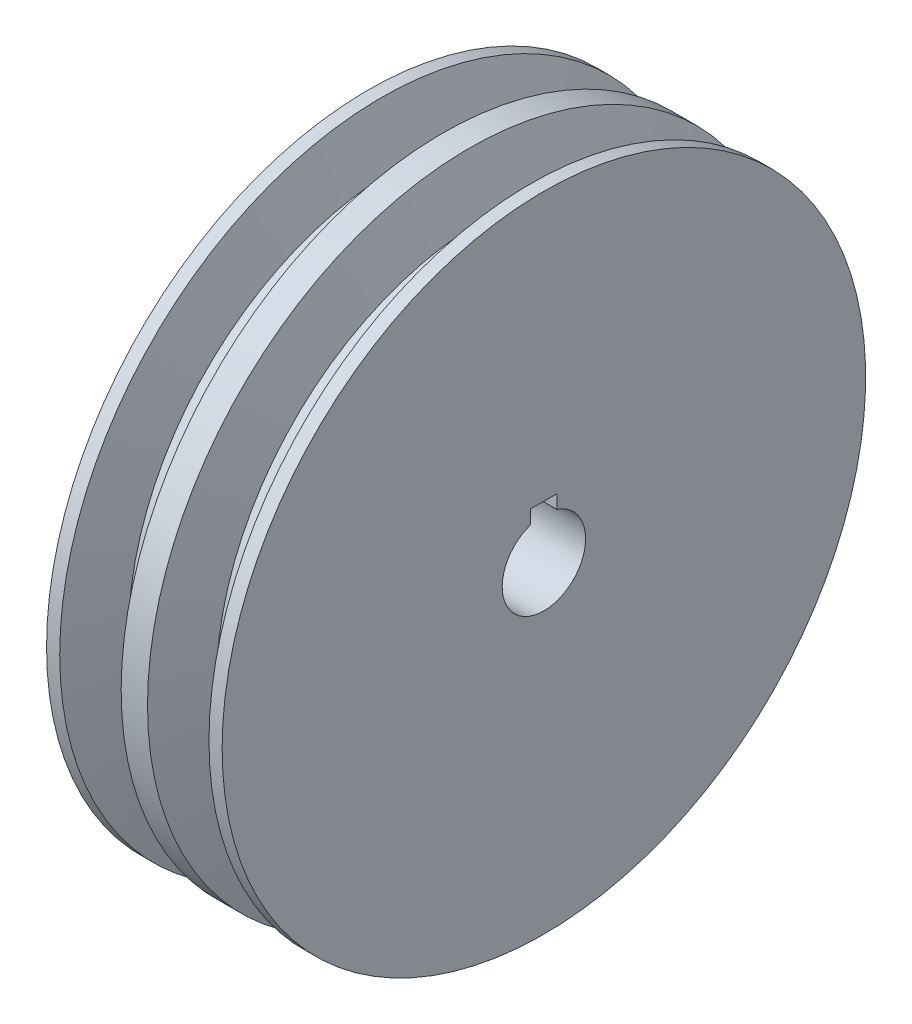
ISO-10303-21;
HEADER;
FILE_DESCRIPTION(('STEP AP214'),'2;1');
FILE_NAME('part.step','',(''),(''),'','','');
FILE_SCHEMA(('AUTOMOTIVE_DESIGN { 1 0 10303 214 1 1 1 1 }'));
ENDSEC;
DATA;
#1=APPLICATION_CONTEXT('core data for automotive mechanical design processes');
#2=APPLICATION_PROTOCOL_DEFINITION('international standard','automotive_design',2000,#1);
#3=PRODUCT_CONTEXT('',#1,'mechanical');
#4=PRODUCT('Part','Part','',(#3));
#5=PRODUCT_RELATED_PRODUCT_CATEGORY('part','',(#4));
#6=PRODUCT_DEFINITION_FORMATION('','',#4);
#7=PRODUCT_DEFINITION_CONTEXT('part definition',#1,'design');
#8=PRODUCT_DEFINITION('design','',#6,#7);
#9=PRODUCT_DEFINITION_SHAPE('','',#8);
#10=(LENGTH_UNIT() NAMED_UNIT(*) SI_UNIT(.MILLI.,.METRE.));
#11=(NAMED_UNIT(*) PLANE_ANGLE_UNIT() SI_UNIT($,.RADIAN.));
#12=(NAMED_UNIT(*) SI_UNIT($,.STERADIAN.) SOLID_ANGLE_UNIT());
#13=UNCERTAINTY_MEASURE_WITH_UNIT(LENGTH_MEASURE(1.E-05),#10,'distance_accuracy_value','');
#14=(GEOMETRIC_REPRESENTATION_CONTEXT(3) GLOBAL_UNCERTAINTY_ASSIGNED_CONTEXT((#13)) GLOBAL_UNIT_ASSIGNED_CONTEXT((#10,
#11,#12)) REPRESENTATION_CONTEXT('',''));
#15=CARTESIAN_POINT('',(0.,0.,0.));
#16=DIRECTION('',(0.,0.,1.));
#17=DIRECTION('',(1.,0.,0.));
#18=AXIS2_PLACEMENT_3D('',#15,#16,#17);
#19=CARTESIAN_POINT('',(985.254127108371,0.,379.673045166986));
#20=DIRECTION('',(-1.,0.,0.));
#21=DIRECTION('',(0.,0.,1.));
#22=AXIS2_PLACEMENT_3D('',#19,#20,#21);
#23=PLANE('',#22);
#24=CARTESIAN_POINT('',(985.254127108372,0.,379.673045166986));
#25=DIRECTION('',(-1.,0.,0.));
#26=DIRECTION('',(0.,0.,1.));
#27=AXIS2_PLACEMENT_3D('',#24,#25,#26);
#28=CIRCLE('',#27,73.3);
#29=CARTESIAN_POINT('',(985.254127108371,0.,452.973045166986));
#30=VERTEX_POINT('',#29);
#31=EDGE_CURVE('E112',#30,#30,#28,.T.);
#32=ORIENTED_EDGE('',*,*,#31,.F.);
#33=EDGE_LOOP('',(#32));
#34=FACE_BOUND('',#33,.T.);
#35=CARTESIAN_POINT('',(985.254127108371,0.,379.673045166986));
#36=DIRECTION('',(-1.,0.,0.));
#37=DIRECTION('',(0.,1.,0.));
#38=AXIS2_PLACEMENT_3D('',#35,#36,#37);
#39=CIRCLE('',#38,9.5);
#40=CARTESIAN_POINT('',(985.254127108371,9.01387818865997,376.673045166986));
#41=VERTEX_POINT('',#40);
#42=CARTESIAN_POINT('',(985.254127108371,9.01387818865997,382.673045166986));
#43=VERTEX_POINT('',#42);
#44=EDGE_CURVE('E30',#41,#43,#39,.T.);
#45=ORIENTED_EDGE('',*,*,#44,.T.);
#46=DIRECTION('',(0.,1.,0.));
#47=VECTOR('',#46,1.);
#48=CARTESIAN_POINT('',(985.254127108371,9.01387818865997,382.673045166986));
#49=LINE('',#48,#47);
#50=CARTESIAN_POINT('',(985.254127108371,12.1346610995116,382.673045166986));
#51=VERTEX_POINT('',#50);
#52=EDGE_CURVE('E64',#43,#51,#49,.T.);
#53=ORIENTED_EDGE('',*,*,#52,.T.);
#54=DIRECTION('',(0.,0.,-1.));
#55=VECTOR('',#54,1.);
#56=CARTESIAN_POINT('',(985.254127108371,12.1346610995116,382.673045166986));
#57=LINE('',#56,#55);
#58=CARTESIAN_POINT('',(985.254127108371,12.1346610995116,376.673045166986));
#59=VERTEX_POINT('',#58);
#60=EDGE_CURVE('E71',#51,#59,#57,.T.);
#61=ORIENTED_EDGE('',*,*,#60,.T.);
#62=DIRECTION('',(0.,-1.,0.));
#63=VECTOR('',#62,1.);
#64=CARTESIAN_POINT('',(985.254127108371,9.01387818865997,376.673045166986));
#65=LINE('',#64,#63);
#66=EDGE_CURVE('E74',#59,#41,#65,.T.);
#67=ORIENTED_EDGE('',*,*,#66,.T.);
#68=EDGE_LOOP('',(#45,#53,#61,#67));
#69=FACE_BOUND('',#68,.T.);
#70=ADVANCED_FACE('F16',(#34,#69),#23,.F.);
#71=CARTESIAN_POINT('',(945.254127108371,0.,452.973045166986));
#72=DIRECTION('',(1.,0.,0.));
#73=DIRECTION('',(0.,0.,-1.));
#74=AXIS2_PLACEMENT_3D('',#71,#72,#73);
#75=PLANE('',#74);
#76=CARTESIAN_POINT('',(945.254127108372,0.,379.673045166986));
#77=DIRECTION('',(-1.,0.,0.));
#78=DIRECTION('',(0.,0.,1.));
#79=AXIS2_PLACEMENT_3D('',#76,#77,#78);
#80=CIRCLE('',#79,73.3);
#81=CARTESIAN_POINT('',(945.254127108371,0.,452.973045166986));
#82=VERTEX_POINT('',#81);
#83=EDGE_CURVE('E60',#82,#82,#80,.T.);
#84=ORIENTED_EDGE('',*,*,#83,.T.);
#85=EDGE_LOOP('',(#84));
#86=FACE_BOUND('',#85,.T.);
#87=CARTESIAN_POINT('',(945.254127108372,0.,379.673045166986));
#88=DIRECTION('',(1.,0.,0.));
#89=DIRECTION('',(0.,0.,-1.));
#90=AXIS2_PLACEMENT_3D('',#87,#88,#89);
#91=CIRCLE('',#90,9.5);
#92=CARTESIAN_POINT('',(945.254127108371,9.01387818865997,376.673045166986));
#93=VERTEX_POINT('',#92);
#94=CARTESIAN_POINT('',(945.254127108371,9.01387818865997,382.673045166986));
#95=VERTEX_POINT('',#94);
#96=EDGE_CURVE('E10',#93,#95,#91,.F.);
#97=ORIENTED_EDGE('',*,*,#96,.F.);
#98=DIRECTION('',(0.,-1.,0.));
#99=VECTOR('',#98,1.);
#100=CARTESIAN_POINT('',(945.254127108372,0.,376.673045166986));
#101=LINE('',#100,#99);
#102=CARTESIAN_POINT('',(945.254127108372,12.1346610995116,376.673045166986));
#103=VERTEX_POINT('',#102);
#104=EDGE_CURVE('E115',#103,#93,#101,.T.);
#105=ORIENTED_EDGE('',*,*,#104,.F.);
#106=DIRECTION('',(0.,0.,-1.));
#107=VECTOR('',#106,1.);
#108=CARTESIAN_POINT('',(945.254127108371,12.1346610995116,452.973045166986));
#109=LINE('',#108,#107);
#110=CARTESIAN_POINT('',(945.254127108371,12.1346610995116,382.673045166986));
#111=VERTEX_POINT('',#110);
#112=EDGE_CURVE('E117',#111,#103,#109,.T.);
#113=ORIENTED_EDGE('',*,*,#112,.F.);
#114=DIRECTION('',(0.,1.,0.));
#115=VECTOR('',#114,1.);
#116=CARTESIAN_POINT('',(945.254127108372,0.,382.673045166986));
#117=LINE('',#116,#115);
#118=EDGE_CURVE('E23',#95,#111,#117,.T.);
#119=ORIENTED_EDGE('',*,*,#118,.F.);
#120=EDGE_LOOP('',(#97,#105,#113,#119));
#121=FACE_BOUND('',#120,.T.);
#122=ADVANCED_FACE('F123',(#86,#121),#75,.F.);
#123=CARTESIAN_POINT('',(945.254127108372,0.,379.673045166986));
#124=DIRECTION('',(-1.,0.,0.));
#125=DIRECTION('',(0.,0.,1.));
#126=AXIS2_PLACEMENT_3D('',#123,#124,#125);
#127=CYLINDRICAL_SURFACE('',#126,73.3);
#128=CARTESIAN_POINT('',(982.254127108372,0.,379.673045166986));
#129=DIRECTION('',(-1.,0.,0.));
#130=DIRECTION('',(0.,0.,1.));
#131=AXIS2_PLACEMENT_3D('',#128,#129,#130);
#132=CIRCLE('',#131,73.3);
#133=CARTESIAN_POINT('',(982.254127108371,0.,452.973045166986));
#134=VERTEX_POINT('',#133);
#135=EDGE_CURVE('E109',#134,#134,#132,.T.);
#136=ORIENTED_EDGE('',*,*,#135,.F.);
#137=EDGE_LOOP('',(#136));
#138=FACE_BOUND('',#137,.T.);
#139=ORIENTED_EDGE('',*,*,#31,.T.);
#140=EDGE_LOOP('',(#139));
#141=FACE_BOUND('',#140,.T.);
#142=ADVANCED_FACE('F144',(#138,#141),#127,.T.);
#143=CARTESIAN_POINT('',(982.254127108372,0.,379.673045166986));
#144=DIRECTION('',(1.,0.,0.));
#145=DIRECTION('',(0.,0.,-1.));
#146=AXIS2_PLACEMENT_3D('',#143,#144,#145);
#147=CONICAL_SURFACE('',#146,73.3,1.27409035395586);
#148=CARTESIAN_POINT('',(978.585358930868,0.,379.673045166986));
#149=DIRECTION('',(-1.,0.,0.));
#150=DIRECTION('',(0.,0.,1.));
#151=AXIS2_PLACEMENT_3D('',#148,#149,#150);
#152=CIRCLE('',#151,61.3);
#153=CARTESIAN_POINT('',(978.585358930868,0.,440.973045166986));
#154=VERTEX_POINT('',#153);
#155=EDGE_CURVE('E106',#154,#154,#152,.T.);
#156=ORIENTED_EDGE('',*,*,#155,.F.);
#157=EDGE_LOOP('',(#156));
#158=FACE_BOUND('',#157,.T.);
#159=ORIENTED_EDGE('',*,*,#135,.T.);
#160=EDGE_LOOP('',(#159));
#161=FACE_BOUND('',#160,.T.);
#162=ADVANCED_FACE('F150',(#158,#161),#147,.T.);
#163=CARTESIAN_POINT('',(945.254127108372,0.,379.673045166986));
#164=DIRECTION('',(-1.,0.,0.));
#165=DIRECTION('',(0.,0.,1.));
#166=AXIS2_PLACEMENT_3D('',#163,#164,#165);
#167=CYLINDRICAL_SURFACE('',#166,61.3);
#168=CARTESIAN_POINT('',(971.922895285875,0.,379.673045166986));
#169=DIRECTION('',(-1.,0.,0.));
#170=DIRECTION('',(0.,0.,1.));
#171=AXIS2_PLACEMENT_3D('',#168,#169,#170);
#172=CIRCLE('',#171,61.3);
#173=CARTESIAN_POINT('',(971.922895285875,0.,440.973045166986));
#174=VERTEX_POINT('',#173);
#175=EDGE_CURVE('E103',#174,#174,#172,.T.);
#176=ORIENTED_EDGE('',*,*,#175,.F.);
#177=EDGE_LOOP('',(#176));
#178=FACE_BOUND('',#177,.T.);
#179=ORIENTED_EDGE('',*,*,#155,.T.);
#180=EDGE_LOOP('',(#179));
#181=FACE_BOUND('',#180,.T.);
#182=ADVANCED_FACE('F155',(#178,#181),#167,.T.);
#183=CARTESIAN_POINT('',(971.922895285875,0.,379.673045166986));
#184=DIRECTION('',(-1.,0.,0.));
#185=DIRECTION('',(0.,0.,1.));
#186=AXIS2_PLACEMENT_3D('',#183,#184,#185);
#187=CONICAL_SURFACE('',#186,61.3,1.27409035395586);
#188=CARTESIAN_POINT('',(968.254127108372,0.,379.673045166986));
#189=DIRECTION('',(-1.,0.,0.));
#190=DIRECTION('',(0.,0.,1.));
#191=AXIS2_PLACEMENT_3D('',#188,#189,#190);
#192=CIRCLE('',#191,73.3);
#193=CARTESIAN_POINT('',(968.254127108371,0.,452.973045166986));
#194=VERTEX_POINT('',#193);
#195=EDGE_CURVE('E100',#194,#194,#192,.T.);
#196=ORIENTED_EDGE('',*,*,#195,.F.);
#197=EDGE_LOOP('',(#196));
#198=FACE_BOUND('',#197,.T.);
#199=ORIENTED_EDGE('',*,*,#175,.T.);
#200=EDGE_LOOP('',(#199));
#201=FACE_BOUND('',#200,.T.);
#202=ADVANCED_FACE('F162',(#198,#201),#187,.T.);
#203=CARTESIAN_POINT('',(945.254127108372,0.,379.673045166986));
#204=DIRECTION('',(-1.,0.,0.));
#205=DIRECTION('',(0.,0.,1.));
#206=AXIS2_PLACEMENT_3D('',#203,#204,#205);
#207=CYLINDRICAL_SURFACE('',#206,73.3);
#208=CARTESIAN_POINT('',(962.254127108372,0.,379.673045166986));
#209=DIRECTION('',(-1.,0.,0.));
#210=DIRECTION('',(0.,0.,1.));
#211=AXIS2_PLACEMENT_3D('',#208,#209,#210);
#212=CIRCLE('',#211,73.3);
#213=CARTESIAN_POINT('',(962.254127108371,0.,452.973045166986));
#214=VERTEX_POINT('',#213);
#215=EDGE_CURVE('E97',#214,#214,#212,.T.);
#216=ORIENTED_EDGE('',*,*,#215,.F.);
#217=EDGE_LOOP('',(#216));
#218=FACE_BOUND('',#217,.T.);
#219=ORIENTED_EDGE('',*,*,#195,.T.);
#220=EDGE_LOOP('',(#219));
#221=FACE_BOUND('',#220,.T.);
#222=ADVANCED_FACE('F166',(#218,#221),#207,.T.);
#223=CARTESIAN_POINT('',(962.254127108372,0.,379.673045166986));
#224=DIRECTION('',(1.,0.,0.));
#225=DIRECTION('',(0.,0.,-1.));
#226=AXIS2_PLACEMENT_3D('',#223,#224,#225);
#227=CONICAL_SURFACE('',#226,73.3,1.27409035395586);
#228=CARTESIAN_POINT('',(958.585358930868,0.,379.673045166986));
#229=DIRECTION('',(-1.,0.,0.));
#230=DIRECTION('',(0.,0.,1.));
#231=AXIS2_PLACEMENT_3D('',#228,#229,#230);
#232=CIRCLE('',#231,61.3);
#233=CARTESIAN_POINT('',(958.585358930868,0.,440.973045166986));
#234=VERTEX_POINT('',#233);
#235=EDGE_CURVE('E94',#234,#234,#232,.T.);
#236=ORIENTED_EDGE('',*,*,#235,.F.);
#237=EDGE_LOOP('',(#236));
#238=FACE_BOUND('',#237,.T.);
#239=ORIENTED_EDGE('',*,*,#215,.T.);
#240=EDGE_LOOP('',(#239));
#241=FACE_BOUND('',#240,.T.);
#242=ADVANCED_FACE('F170',(#238,#241),#227,.T.);
#243=CARTESIAN_POINT('',(945.254127108372,0.,379.673045166986));
#244=DIRECTION('',(-1.,0.,0.));
#245=DIRECTION('',(0.,0.,1.));
#246=AXIS2_PLACEMENT_3D('',#243,#244,#245);
#247=CYLINDRICAL_SURFACE('',#246,61.3);
#248=CARTESIAN_POINT('',(951.922895285875,0.,379.673045166986));
#249=DIRECTION('',(-1.,0.,0.));
#250=DIRECTION('',(0.,0.,1.));
#251=AXIS2_PLACEMENT_3D('',#248,#249,#250);
#252=CIRCLE('',#251,61.3);
#253=CARTESIAN_POINT('',(951.922895285875,0.,440.973045166986));
#254=VERTEX_POINT('',#253);
#255=EDGE_CURVE('E91',#254,#254,#252,.T.);
#256=ORIENTED_EDGE('',*,*,#255,.F.);
#257=EDGE_LOOP('',(#256));
#258=FACE_BOUND('',#257,.T.);
#259=ORIENTED_EDGE('',*,*,#235,.T.);
#260=EDGE_LOOP('',(#259));
#261=FACE_BOUND('',#260,.T.);
#262=ADVANCED_FACE('F174',(#258,#261),#247,.T.);
#263=CARTESIAN_POINT('',(951.922895285875,0.,379.673045166986));
#264=DIRECTION('',(-1.,0.,0.));
#265=DIRECTION('',(0.,0.,1.));
#266=AXIS2_PLACEMENT_3D('',#263,#264,#265);
#267=CONICAL_SURFACE('',#266,61.3,1.27409035395586);
#268=CARTESIAN_POINT('',(948.254127108372,0.,379.673045166986));
#269=DIRECTION('',(-1.,0.,0.));
#270=DIRECTION('',(0.,0.,1.));
#271=AXIS2_PLACEMENT_3D('',#268,#269,#270);
#272=CIRCLE('',#271,73.3);
#273=CARTESIAN_POINT('',(948.254127108371,0.,452.973045166986));
#274=VERTEX_POINT('',#273);
#275=EDGE_CURVE('E88',#274,#274,#272,.T.);
#276=ORIENTED_EDGE('',*,*,#275,.F.);
#277=EDGE_LOOP('',(#276));
#278=FACE_BOUND('',#277,.T.);
#279=ORIENTED_EDGE('',*,*,#255,.T.);
#280=EDGE_LOOP('',(#279));
#281=FACE_BOUND('',#280,.T.);
#282=ADVANCED_FACE('F178',(#278,#281),#267,.T.);
#283=CARTESIAN_POINT('',(945.254127108372,0.,379.673045166986));
#284=DIRECTION('',(-1.,0.,0.));
#285=DIRECTION('',(0.,0.,1.));
#286=AXIS2_PLACEMENT_3D('',#283,#284,#285);
#287=CYLINDRICAL_SURFACE('',#286,73.3);
#288=ORIENTED_EDGE('',*,*,#83,.F.);
#289=EDGE_LOOP('',(#288));
#290=FACE_BOUND('',#289,.T.);
#291=ORIENTED_EDGE('',*,*,#275,.T.);
#292=EDGE_LOOP('',(#291));
#293=FACE_BOUND('',#292,.T.);
#294=ADVANCED_FACE('F182',(#290,#293),#287,.T.);
#295=CARTESIAN_POINT('',(742.90969669357,0.,379.673045166986));
#296=DIRECTION('',(1.,0.,0.));
#297=DIRECTION('',(0.,0.,-1.));
#298=AXIS2_PLACEMENT_3D('',#295,#296,#297);
#299=CYLINDRICAL_SURFACE('',#298,9.5);
#300=ORIENTED_EDGE('',*,*,#96,.T.);
#301=DIRECTION('',(1.,0.,0.));
#302=VECTOR('',#301,1.);
#303=CARTESIAN_POINT('',(742.90969669357,9.01387818865997,382.673045166986));
#304=LINE('',#303,#302);
#305=EDGE_CURVE('E54',#95,#43,#304,.T.);
#306=ORIENTED_EDGE('',*,*,#305,.T.);
#307=ORIENTED_EDGE('',*,*,#44,.F.);
#308=DIRECTION('',(1.,0.,0.));
#309=VECTOR('',#308,1.);
#310=CARTESIAN_POINT('',(742.90969669357,9.01387818865997,376.673045166986));
#311=LINE('',#310,#309);
#312=EDGE_CURVE('E82',#93,#41,#311,.T.);
#313=ORIENTED_EDGE('',*,*,#312,.F.);
#314=EDGE_LOOP('',(#300,#306,#307,#313));
#315=FACE_BOUND('',#314,.T.);
#316=ADVANCED_FACE('F56',(#315),#299,.F.);
#317=CARTESIAN_POINT('',(742.90969669357,9.01387818865997,382.673045166986));
#318=DIRECTION('',(0.,0.,-1.));
#319=DIRECTION('',(-1.,0.,0.));
#320=AXIS2_PLACEMENT_3D('',#317,#318,#319);
#321=PLANE('',#320);
#322=ORIENTED_EDGE('',*,*,#118,.T.);
#323=DIRECTION('',(1.,0.,0.));
#324=VECTOR('',#323,1.);
#325=CARTESIAN_POINT('',(742.90969669357,12.1346610995116,382.673045166986));
#326=LINE('',#325,#324);
#327=EDGE_CURVE('E61',#111,#51,#326,.T.);
#328=ORIENTED_EDGE('',*,*,#327,.T.);
#329=ORIENTED_EDGE('',*,*,#52,.F.);
#330=ORIENTED_EDGE('',*,*,#305,.F.);
#331=EDGE_LOOP('',(#322,#328,#329,#330));
#332=FACE_BOUND('',#331,.T.);
#333=ADVANCED_FACE('F65',(#332),#321,.T.);
#334=CARTESIAN_POINT('',(742.90969669357,12.1346610995116,382.673045166986));
#335=DIRECTION('',(0.,-1.,0.));
#336=DIRECTION('',(0.,0.,-1.));
#337=AXIS2_PLACEMENT_3D('',#334,#335,#336);
#338=PLANE('',#337);
#339=ORIENTED_EDGE('',*,*,#112,.T.);
#340=DIRECTION('',(1.,0.,0.));
#341=VECTOR('',#340,1.);
#342=CARTESIAN_POINT('',(742.90969669357,12.1346610995116,376.673045166986));
#343=LINE('',#342,#341);
#344=EDGE_CURVE('E38',#103,#59,#343,.T.);
#345=ORIENTED_EDGE('',*,*,#344,.T.);
#346=ORIENTED_EDGE('',*,*,#60,.F.);
#347=ORIENTED_EDGE('',*,*,#327,.F.);
#348=EDGE_LOOP('',(#339,#345,#346,#347));
#349=FACE_BOUND('',#348,.T.);
#350=ADVANCED_FACE('F121',(#349),#338,.T.);
#351=CARTESIAN_POINT('',(742.90969669357,9.01387818865997,376.673045166986));
#352=DIRECTION('',(0.,0.,1.));
#353=DIRECTION('',(1.,0.,0.));
#354=AXIS2_PLACEMENT_3D('',#351,#352,#353);
#355=PLANE('',#354);
#356=ORIENTED_EDGE('',*,*,#104,.T.);
#357=ORIENTED_EDGE('',*,*,#312,.T.);
#358=ORIENTED_EDGE('',*,*,#66,.F.);
#359=ORIENTED_EDGE('',*,*,#344,.F.);
#360=EDGE_LOOP('',(#356,#357,#358,#359));
#361=FACE_BOUND('',#360,.T.);
#362=ADVANCED_FACE('F124',(#361),#355,.T.);
#363=CLOSED_SHELL('',(#70,#122,#142,#162,#182,#202,#222,#242,#262,#282,#294,#316,#333,#350,#362));
#364=MANIFOLD_SOLID_BREP('B1',#363);
#365=ADVANCED_BREP_SHAPE_REPRESENTATION('',(#18,#364),#14);
#366=SHAPE_DEFINITION_REPRESENTATION(#9,#365);
ENDSEC;
END-ISO-10303-21;
